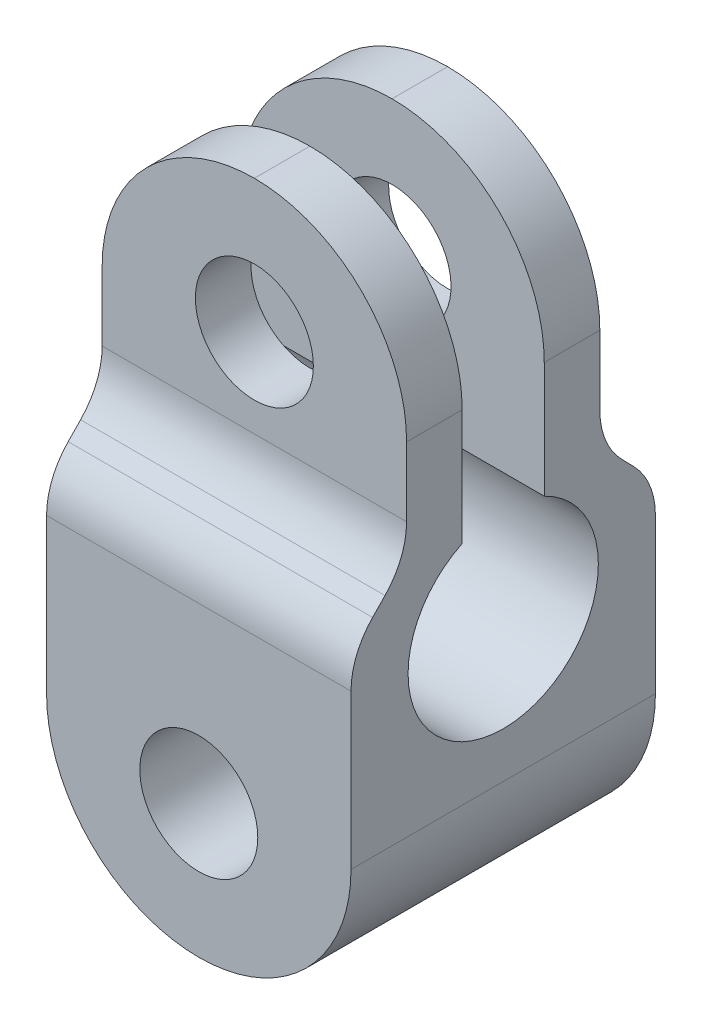
ISO-10303-21;
HEADER;
FILE_DESCRIPTION(('STEP AP214'),'2;1');
FILE_NAME('part.step','',(''),(''),'','','');
FILE_SCHEMA(('AUTOMOTIVE_DESIGN { 1 0 10303 214 1 1 1 1 }'));
ENDSEC;
DATA;
#1=APPLICATION_CONTEXT('core data for automotive mechanical design processes');
#2=APPLICATION_PROTOCOL_DEFINITION('international standard','automotive_design',2000,#1);
#3=PRODUCT_CONTEXT('',#1,'mechanical');
#4=PRODUCT('Part','Part','',(#3));
#5=PRODUCT_RELATED_PRODUCT_CATEGORY('part','',(#4));
#6=PRODUCT_DEFINITION_FORMATION('','',#4);
#7=PRODUCT_DEFINITION_CONTEXT('part definition',#1,'design');
#8=PRODUCT_DEFINITION('design','',#6,#7);
#9=PRODUCT_DEFINITION_SHAPE('','',#8);
#10=(LENGTH_UNIT() NAMED_UNIT(*) SI_UNIT(.MILLI.,.METRE.));
#11=(NAMED_UNIT(*) PLANE_ANGLE_UNIT() SI_UNIT($,.RADIAN.));
#12=(NAMED_UNIT(*) SI_UNIT($,.STERADIAN.) SOLID_ANGLE_UNIT());
#13=UNCERTAINTY_MEASURE_WITH_UNIT(LENGTH_MEASURE(1.E-05),#10,'distance_accuracy_value','');
#14=(GEOMETRIC_REPRESENTATION_CONTEXT(3) GLOBAL_UNCERTAINTY_ASSIGNED_CONTEXT((#13)) GLOBAL_UNIT_ASSIGNED_CONTEXT((#10,
#11,#12)) REPRESENTATION_CONTEXT('',''));
#15=CARTESIAN_POINT('',(0.,0.,0.));
#16=DIRECTION('',(0.,0.,1.));
#17=DIRECTION('',(1.,0.,0.));
#18=AXIS2_PLACEMENT_3D('',#15,#16,#17);
#19=CARTESIAN_POINT('',(-4.,13.,8.));
#20=DIRECTION('',(0.,0.,-1.));
#21=DIRECTION('',(-1.,0.,0.));
#22=AXIS2_PLACEMENT_3D('',#19,#20,#21);
#23=CYLINDRICAL_SURFACE('',#22,4.);
#24=CARTESIAN_POINT('',(-4.,13.,1.46076012645322));
#25=DIRECTION('',(0.,0.,1.));
#26=DIRECTION('',(0.,-1.,0.));
#27=AXIS2_PLACEMENT_3D('',#24,#25,#26);
#28=CIRCLE('',#27,4.);
#29=CARTESIAN_POINT('',(-8.,13.,1.46076012645322));
#30=VERTEX_POINT('',#29);
#31=CARTESIAN_POINT('',(-4.,17.,1.46076012645322));
#32=VERTEX_POINT('',#31);
#33=EDGE_CURVE('E278',#30,#32,#28,.F.);
#34=ORIENTED_EDGE('',*,*,#33,.F.);
#35=DIRECTION('',(0.,0.,-1.));
#36=VECTOR('',#35,1.);
#37=CARTESIAN_POINT('',(-8.,13.,8.));
#38=LINE('',#37,#36);
#39=CARTESIAN_POINT('',(-8.,13.,2.92152025290644));
#40=VERTEX_POINT('',#39);
#41=EDGE_CURVE('E196',#40,#30,#38,.T.);
#42=ORIENTED_EDGE('',*,*,#41,.F.);
#43=CARTESIAN_POINT('',(-4.,13.,2.92152025290644));
#44=DIRECTION('',(0.,0.,-1.));
#45=DIRECTION('',(-1.,0.,0.));
#46=AXIS2_PLACEMENT_3D('',#43,#44,#45);
#47=CIRCLE('',#46,4.);
#48=CARTESIAN_POINT('',(-4.,17.,2.92152025290644));
#49=VERTEX_POINT('',#48);
#50=EDGE_CURVE('E302',#49,#40,#47,.F.);
#51=ORIENTED_EDGE('',*,*,#50,.F.);
#52=DIRECTION('',(0.,0.,-1.));
#53=VECTOR('',#52,1.);
#54=CARTESIAN_POINT('',(-4.,17.,8.));
#55=LINE('',#54,#53);
#56=EDGE_CURVE('E210',#32,#49,#55,.F.);
#57=ORIENTED_EDGE('',*,*,#56,.F.);
#58=EDGE_LOOP('',(#34,#42,#51,#57));
#59=FACE_BOUND('',#58,.T.);
#60=ADVANCED_FACE('F36',(#59),#23,.T.);
#61=CARTESIAN_POINT('',(-4.,13.,8.));
#62=DIRECTION('',(0.,0.,-1.));
#63=DIRECTION('',(-1.,0.,0.));
#64=AXIS2_PLACEMENT_3D('',#61,#62,#63);
#65=CYLINDRICAL_SURFACE('',#64,4.);
#66=CARTESIAN_POINT('',(-4.,13.,1.46076012645322));
#67=DIRECTION('',(0.,0.,1.));
#68=DIRECTION('',(0.,-1.,0.));
#69=AXIS2_PLACEMENT_3D('',#66,#67,#68);
#70=CIRCLE('',#69,4.);
#71=CARTESIAN_POINT('',(0.,13.,1.46076012645322));
#72=VERTEX_POINT('',#71);
#73=EDGE_CURVE('E266',#32,#72,#70,.F.);
#74=ORIENTED_EDGE('',*,*,#73,.F.);
#75=ORIENTED_EDGE('',*,*,#56,.T.);
#76=CARTESIAN_POINT('',(-4.,13.,2.92152025290644));
#77=DIRECTION('',(0.,0.,-1.));
#78=DIRECTION('',(-1.,0.,0.));
#79=AXIS2_PLACEMENT_3D('',#76,#77,#78);
#80=CIRCLE('',#79,4.);
#81=CARTESIAN_POINT('',(0.,13.,2.92152025290644));
#82=VERTEX_POINT('',#81);
#83=EDGE_CURVE('E299',#82,#49,#80,.F.);
#84=ORIENTED_EDGE('',*,*,#83,.F.);
#85=DIRECTION('',(0.,0.,-1.));
#86=VECTOR('',#85,1.);
#87=CARTESIAN_POINT('',(0.,13.,8.));
#88=LINE('',#87,#86);
#89=EDGE_CURVE('E326',#72,#82,#88,.F.);
#90=ORIENTED_EDGE('',*,*,#89,.F.);
#91=EDGE_LOOP('',(#74,#75,#84,#90));
#92=FACE_BOUND('',#91,.T.);
#93=ADVANCED_FACE('F372',(#92),#65,.T.);
#94=CARTESIAN_POINT('',(-4.,13.5,0.));
#95=DIRECTION('',(0.,0.,1.));
#96=DIRECTION('',(1.,0.,0.));
#97=AXIS2_PLACEMENT_3D('',#94,#95,#96);
#98=CYLINDRICAL_SURFACE('',#97,1.55);
#99=CARTESIAN_POINT('',(-4.,13.5,1.46076012645322));
#100=DIRECTION('',(0.,0.,1.));
#101=DIRECTION('',(0.,-1.,0.));
#102=AXIS2_PLACEMENT_3D('',#99,#100,#101);
#103=CIRCLE('',#102,1.55);
#104=CARTESIAN_POINT('',(-4.,11.95,1.46076012645322));
#105=VERTEX_POINT('',#104);
#106=EDGE_CURVE('E179',#105,#105,#103,.F.);
#107=ORIENTED_EDGE('',*,*,#106,.T.);
#108=EDGE_LOOP('',(#107));
#109=FACE_BOUND('',#108,.T.);
#110=CARTESIAN_POINT('',(-4.,13.5,2.92152025290644));
#111=DIRECTION('',(0.,0.,-1.));
#112=DIRECTION('',(-1.,0.,0.));
#113=AXIS2_PLACEMENT_3D('',#110,#111,#112);
#114=CIRCLE('',#113,1.55);
#115=CARTESIAN_POINT('',(-5.55,13.5,2.92152025290644));
#116=VERTEX_POINT('',#115);
#117=EDGE_CURVE('E296',#116,#116,#114,.F.);
#118=ORIENTED_EDGE('',*,*,#117,.T.);
#119=EDGE_LOOP('',(#118));
#120=FACE_BOUND('',#119,.T.);
#121=ADVANCED_FACE('F378',(#109,#120),#98,.F.);
#122=CARTESIAN_POINT('',(0.,17.,8.));
#123=DIRECTION('',(-1.,0.,0.));
#124=DIRECTION('',(0.,0.,1.));
#125=AXIS2_PLACEMENT_3D('',#122,#123,#124);
#126=PLANE('',#125);
#127=DIRECTION('',(0.,-0.71641537047614,0.697674004779837));
#128=VECTOR('',#127,1.);
#129=CARTESIAN_POINT('',(0.,8.86930639376291,8.));
#130=LINE('',#129,#128);
#131=CARTESIAN_POINT('',(0.,9.7869014710346,7.1064091325945));
#132=VERTEX_POINT('',#131);
#133=CARTESIAN_POINT('',(0.,9.45171131649122,7.43283074095228));
#134=VERTEX_POINT('',#133);
#135=EDGE_CURVE('E222',#132,#134,#130,.T.);
#136=ORIENTED_EDGE('',*,*,#135,.T.);
#137=CARTESIAN_POINT('',(0.,8.05636330693154,6.));
#138=DIRECTION('',(-1.,0.,0.));
#139=DIRECTION('',(0.,0.,1.));
#140=AXIS2_PLACEMENT_3D('',#137,#138,#139);
#141=CIRCLE('',#140,2.);
#142=CARTESIAN_POINT('',(0.,8.05636330693154,8.));
#143=VERTEX_POINT('',#142);
#144=EDGE_CURVE('E236',#134,#143,#141,.F.);
#145=ORIENTED_EDGE('',*,*,#144,.T.);
#146=DIRECTION('',(0.,1.,0.));
#147=VECTOR('',#146,1.);
#148=CARTESIAN_POINT('',(0.,17.,8.));
#149=LINE('',#148,#147);
#150=CARTESIAN_POINT('',(0.,4.,8.));
#151=VERTEX_POINT('',#150);
#152=EDGE_CURVE('E316',#151,#143,#149,.T.);
#153=ORIENTED_EDGE('',*,*,#152,.F.);
#154=DIRECTION('',(0.,0.,-1.));
#155=VECTOR('',#154,1.);
#156=CARTESIAN_POINT('',(0.,4.,8.));
#157=LINE('',#156,#155);
#158=CARTESIAN_POINT('',(0.,4.,0.));
#159=VERTEX_POINT('',#158);
#160=EDGE_CURVE('E328',#151,#159,#157,.T.);
#161=ORIENTED_EDGE('',*,*,#160,.T.);
#162=DIRECTION('',(0.,1.,0.));
#163=VECTOR('',#162,1.);
#164=CARTESIAN_POINT('',(0.,17.,0.));
#165=LINE('',#164,#163);
#166=CARTESIAN_POINT('',(0.,8.05636330693154,0.));
#167=VERTEX_POINT('',#166);
#168=EDGE_CURVE('E209',#159,#167,#165,.T.);
#169=ORIENTED_EDGE('',*,*,#168,.T.);
#170=CARTESIAN_POINT('',(0.,8.05636330693154,2.));
#171=DIRECTION('',(-1.,0.,0.));
#172=DIRECTION('',(0.,0.,1.));
#173=AXIS2_PLACEMENT_3D('',#170,#171,#172);
#174=CIRCLE('',#173,2.);
#175=CARTESIAN_POINT('',(0.,9.45171131649122,0.567169259047721));
#176=VERTEX_POINT('',#175);
#177=EDGE_CURVE('E234',#167,#176,#174,.F.);
#178=ORIENTED_EDGE('',*,*,#177,.T.);
#179=DIRECTION('',(0.,0.71641537047614,0.697674004779837));
#180=VECTOR('',#179,1.);
#181=CARTESIAN_POINT('',(0.,8.86930639376291,0.));
#182=LINE('',#181,#180);
#183=CARTESIAN_POINT('',(0.,9.7869014710346,0.893590867405501));
#184=VERTEX_POINT('',#183);
#185=EDGE_CURVE('E268',#176,#184,#182,.T.);
#186=ORIENTED_EDGE('',*,*,#185,.T.);
#187=CARTESIAN_POINT('',(0.,11.1822494805943,-0.539239873546778));
#188=DIRECTION('',(-1.,0.,0.));
#189=DIRECTION('',(0.,0.,1.));
#190=AXIS2_PLACEMENT_3D('',#187,#188,#189);
#191=CIRCLE('',#190,2.);
#192=CARTESIAN_POINT('',(0.,11.1822494805943,1.46076012645322));
#193=VERTEX_POINT('',#192);
#194=EDGE_CURVE('E11',#184,#193,#191,.T.);
#195=ORIENTED_EDGE('',*,*,#194,.T.);
#196=DIRECTION('',(0.,1.,0.));
#197=VECTOR('',#196,1.);
#198=CARTESIAN_POINT('',(0.,10.3693063937629,1.46076012645322));
#199=LINE('',#198,#197);
#200=EDGE_CURVE('E190',#193,#72,#199,.T.);
#201=ORIENTED_EDGE('',*,*,#200,.T.);
#202=ORIENTED_EDGE('',*,*,#89,.T.);
#203=DIRECTION('',(0.,-1.,0.));
#204=VECTOR('',#203,1.);
#205=CARTESIAN_POINT('',(0.,9.95541158884781,2.92152025290644));
#206=LINE('',#205,#204);
#207=CARTESIAN_POINT('',(0.,9.95541158884781,2.92152025290644));
#208=VERTEX_POINT('',#207);
#209=EDGE_CURVE('E284',#82,#208,#206,.T.);
#210=ORIENTED_EDGE('',*,*,#209,.T.);
#211=CARTESIAN_POINT('',(0.,7.7,4.));
#212=DIRECTION('',(-1.,0.,0.));
#213=DIRECTION('',(0.,0.,1.));
#214=AXIS2_PLACEMENT_3D('',#211,#212,#213);
#215=CIRCLE('',#214,2.5);
#216=CARTESIAN_POINT('',(0.,9.95541158884781,5.07847974709356));
#217=VERTEX_POINT('',#216);
#218=EDGE_CURVE('E305',#208,#217,#215,.T.);
#219=ORIENTED_EDGE('',*,*,#218,.T.);
#220=DIRECTION('',(0.,1.,0.));
#221=VECTOR('',#220,1.);
#222=CARTESIAN_POINT('',(0.,9.95541158884781,5.07847974709356));
#223=LINE('',#222,#221);
#224=CARTESIAN_POINT('',(0.,13.,5.07847974709357));
#225=VERTEX_POINT('',#224);
#226=EDGE_CURVE('E281',#217,#225,#223,.T.);
#227=ORIENTED_EDGE('',*,*,#226,.T.);
#228=CARTESIAN_POINT('',(0.,13.,6.53923987354678));
#229=VERTEX_POINT('',#228);
#230=EDGE_CURVE('E322',#225,#229,#88,.F.);
#231=ORIENTED_EDGE('',*,*,#230,.T.);
#232=DIRECTION('',(0.,-1.,0.));
#233=VECTOR('',#232,1.);
#234=CARTESIAN_POINT('',(0.,10.3693063937629,6.53923987354678));
#235=LINE('',#234,#233);
#236=CARTESIAN_POINT('',(0.,11.1822494805943,6.53923987354678));
#237=VERTEX_POINT('',#236);
#238=EDGE_CURVE('E439',#229,#237,#235,.T.);
#239=ORIENTED_EDGE('',*,*,#238,.T.);
#240=CARTESIAN_POINT('',(0.,11.1822494805943,8.53923987354678));
#241=DIRECTION('',(-1.,0.,0.));
#242=DIRECTION('',(0.,0.,1.));
#243=AXIS2_PLACEMENT_3D('',#240,#241,#242);
#244=CIRCLE('',#243,2.);
#245=EDGE_CURVE('E250',#237,#132,#244,.T.);
#246=ORIENTED_EDGE('',*,*,#245,.T.);
#247=EDGE_LOOP('',(#136,#145,#153,#161,#169,#178,#186,#195,#201,#202,#210,#219,#227,#231,#239,#246));
#248=FACE_BOUND('',#247,.T.);
#249=ADVANCED_FACE('F346',(#248),#126,.F.);
#250=CARTESIAN_POINT('',(-8.,0.,8.));
#251=DIRECTION('',(1.,0.,0.));
#252=DIRECTION('',(0.,0.,-1.));
#253=AXIS2_PLACEMENT_3D('',#250,#251,#252);
#254=PLANE('',#253);
#255=DIRECTION('',(0.,-1.,0.));
#256=VECTOR('',#255,1.);
#257=CARTESIAN_POINT('',(-8.,0.,8.));
#258=LINE('',#257,#256);
#259=CARTESIAN_POINT('',(-8.,8.05636330693154,8.));
#260=VERTEX_POINT('',#259);
#261=CARTESIAN_POINT('',(-8.,4.,8.));
#262=VERTEX_POINT('',#261);
#263=EDGE_CURVE('E319',#260,#262,#258,.T.);
#264=ORIENTED_EDGE('',*,*,#263,.F.);
#265=CARTESIAN_POINT('',(-8.,8.05636330693154,6.));
#266=DIRECTION('',(1.,0.,0.));
#267=DIRECTION('',(0.,0.,-1.));
#268=AXIS2_PLACEMENT_3D('',#265,#266,#267);
#269=CIRCLE('',#268,2.);
#270=CARTESIAN_POINT('',(-8.,9.45171131649122,7.43283074095228));
#271=VERTEX_POINT('',#270);
#272=EDGE_CURVE('E227',#260,#271,#269,.F.);
#273=ORIENTED_EDGE('',*,*,#272,.T.);
#274=DIRECTION('',(0.,-0.71641537047614,0.697674004779837));
#275=VECTOR('',#274,1.);
#276=CARTESIAN_POINT('',(-8.,8.86930639376291,8.));
#277=LINE('',#276,#275);
#278=CARTESIAN_POINT('',(-8.,9.7869014710346,7.1064091325945));
#279=VERTEX_POINT('',#278);
#280=EDGE_CURVE('E189',#279,#271,#277,.T.);
#281=ORIENTED_EDGE('',*,*,#280,.F.);
#282=CARTESIAN_POINT('',(-8.,11.1822494805943,8.53923987354678));
#283=DIRECTION('',(1.,0.,0.));
#284=DIRECTION('',(0.,0.,-1.));
#285=AXIS2_PLACEMENT_3D('',#282,#283,#284);
#286=CIRCLE('',#285,2.);
#287=CARTESIAN_POINT('',(-8.,11.1822494805943,6.53923987354678));
#288=VERTEX_POINT('',#287);
#289=EDGE_CURVE('E188',#279,#288,#286,.T.);
#290=ORIENTED_EDGE('',*,*,#289,.T.);
#291=DIRECTION('',(0.,-1.,0.));
#292=VECTOR('',#291,1.);
#293=CARTESIAN_POINT('',(-8.,10.3693063937629,6.53923987354678));
#294=LINE('',#293,#292);
#295=CARTESIAN_POINT('',(-8.,13.,6.53923987354678));
#296=VERTEX_POINT('',#295);
#297=EDGE_CURVE('E171',#296,#288,#294,.T.);
#298=ORIENTED_EDGE('',*,*,#297,.F.);
#299=CARTESIAN_POINT('',(-8.,13.,5.07847974709356));
#300=VERTEX_POINT('',#299);
#301=EDGE_CURVE('E185',#296,#300,#38,.T.);
#302=ORIENTED_EDGE('',*,*,#301,.T.);
#303=DIRECTION('',(0.,1.,0.));
#304=VECTOR('',#303,1.);
#305=CARTESIAN_POINT('',(-8.,9.95541158884781,5.07847974709356));
#306=LINE('',#305,#304);
#307=CARTESIAN_POINT('',(-8.,9.95541158884781,5.07847974709356));
#308=VERTEX_POINT('',#307);
#309=EDGE_CURVE('E280',#308,#300,#306,.T.);
#310=ORIENTED_EDGE('',*,*,#309,.F.);
#311=CARTESIAN_POINT('',(-8.,7.7,4.));
#312=DIRECTION('',(-1.,0.,0.));
#313=DIRECTION('',(0.,0.,1.));
#314=AXIS2_PLACEMENT_3D('',#311,#312,#313);
#315=CIRCLE('',#314,2.5);
#316=CARTESIAN_POINT('',(-8.,9.95541158884781,2.92152025290644));
#317=VERTEX_POINT('',#316);
#318=EDGE_CURVE('E304',#317,#308,#315,.T.);
#319=ORIENTED_EDGE('',*,*,#318,.F.);
#320=DIRECTION('',(0.,-1.,0.));
#321=VECTOR('',#320,1.);
#322=CARTESIAN_POINT('',(-8.,9.95541158884781,2.92152025290644));
#323=LINE('',#322,#321);
#324=EDGE_CURVE('E285',#40,#317,#323,.T.);
#325=ORIENTED_EDGE('',*,*,#324,.F.);
#326=ORIENTED_EDGE('',*,*,#41,.T.);
#327=DIRECTION('',(0.,1.,0.));
#328=VECTOR('',#327,1.);
#329=CARTESIAN_POINT('',(-8.,10.3693063937629,1.46076012645322));
#330=LINE('',#329,#328);
#331=CARTESIAN_POINT('',(-8.,11.1822494805943,1.46076012645322));
#332=VERTEX_POINT('',#331);
#333=EDGE_CURVE('E254',#332,#30,#330,.T.);
#334=ORIENTED_EDGE('',*,*,#333,.F.);
#335=CARTESIAN_POINT('',(-8.,11.1822494805943,-0.539239873546778));
#336=DIRECTION('',(1.,0.,0.));
#337=DIRECTION('',(0.,0.,-1.));
#338=AXIS2_PLACEMENT_3D('',#335,#336,#337);
#339=CIRCLE('',#338,2.);
#340=CARTESIAN_POINT('',(-8.,9.7869014710346,0.893590867405501));
#341=VERTEX_POINT('',#340);
#342=EDGE_CURVE('E44',#332,#341,#339,.T.);
#343=ORIENTED_EDGE('',*,*,#342,.T.);
#344=DIRECTION('',(0.,0.71641537047614,0.697674004779837));
#345=VECTOR('',#344,1.);
#346=CARTESIAN_POINT('',(-8.,8.86930639376291,0.));
#347=LINE('',#346,#345);
#348=CARTESIAN_POINT('',(-8.,9.45171131649122,0.567169259047721));
#349=VERTEX_POINT('',#348);
#350=EDGE_CURVE('E253',#349,#341,#347,.T.);
#351=ORIENTED_EDGE('',*,*,#350,.F.);
#352=CARTESIAN_POINT('',(-8.,8.05636330693154,2.));
#353=DIRECTION('',(1.,0.,0.));
#354=DIRECTION('',(0.,0.,-1.));
#355=AXIS2_PLACEMENT_3D('',#352,#353,#354);
#356=CIRCLE('',#355,2.);
#357=CARTESIAN_POINT('',(-8.,8.05636330693154,0.));
#358=VERTEX_POINT('',#357);
#359=EDGE_CURVE('E225',#349,#358,#356,.F.);
#360=ORIENTED_EDGE('',*,*,#359,.T.);
#361=DIRECTION('',(0.,-1.,0.));
#362=VECTOR('',#361,1.);
#363=CARTESIAN_POINT('',(-8.,0.,0.));
#364=LINE('',#363,#362);
#365=CARTESIAN_POINT('',(-8.,4.,0.));
#366=VERTEX_POINT('',#365);
#367=EDGE_CURVE('E320',#358,#366,#364,.T.);
#368=ORIENTED_EDGE('',*,*,#367,.T.);
#369=DIRECTION('',(0.,0.,-1.));
#370=VECTOR('',#369,1.);
#371=CARTESIAN_POINT('',(-8.,4.,8.));
#372=LINE('',#371,#370);
#373=EDGE_CURVE('E195',#366,#262,#372,.F.);
#374=ORIENTED_EDGE('',*,*,#373,.T.);
#375=EDGE_LOOP('',(#264,#273,#281,#290,#298,#302,#310,#319,#325,#326,#334,#343,#351,#360,#368,#374));
#376=FACE_BOUND('',#375,.T.);
#377=ADVANCED_FACE('F183',(#376),#254,.F.);
#378=CARTESIAN_POINT('',(0.,0.,8.));
#379=DIRECTION('',(0.,0.,-1.));
#380=DIRECTION('',(-1.,0.,0.));
#381=AXIS2_PLACEMENT_3D('',#378,#379,#380);
#382=PLANE('',#381);
#383=CARTESIAN_POINT('',(-4.,3.5,8.));
#384=DIRECTION('',(0.,0.,1.));
#385=DIRECTION('',(1.,0.,0.));
#386=AXIS2_PLACEMENT_3D('',#383,#384,#385);
#387=CIRCLE('',#386,1.55);
#388=CARTESIAN_POINT('',(-2.45,3.5,8.));
#389=VERTEX_POINT('',#388);
#390=EDGE_CURVE('E308',#389,#389,#387,.T.);
#391=ORIENTED_EDGE('',*,*,#390,.F.);
#392=EDGE_LOOP('',(#391));
#393=FACE_BOUND('',#392,.T.);
#394=ORIENTED_EDGE('',*,*,#152,.T.);
#395=DIRECTION('',(-1.,0.,0.));
#396=VECTOR('',#395,1.);
#397=CARTESIAN_POINT('',(0.,8.05636330693154,8.));
#398=LINE('',#397,#396);
#399=EDGE_CURVE('E218',#143,#260,#398,.T.);
#400=ORIENTED_EDGE('',*,*,#399,.T.);
#401=ORIENTED_EDGE('',*,*,#263,.T.);
#402=CARTESIAN_POINT('',(-4.,4.,8.));
#403=DIRECTION('',(0.,0.,-1.));
#404=DIRECTION('',(-1.,0.,0.));
#405=AXIS2_PLACEMENT_3D('',#402,#403,#404);
#406=CIRCLE('',#405,4.);
#407=CARTESIAN_POINT('',(-4.,0.,8.));
#408=VERTEX_POINT('',#407);
#409=EDGE_CURVE('E335',#262,#408,#406,.F.);
#410=ORIENTED_EDGE('',*,*,#409,.T.);
#411=CARTESIAN_POINT('',(-4.,4.,8.));
#412=DIRECTION('',(0.,0.,-1.));
#413=DIRECTION('',(-1.,0.,0.));
#414=AXIS2_PLACEMENT_3D('',#411,#412,#413);
#415=CIRCLE('',#414,4.);
#416=EDGE_CURVE('E202',#408,#151,#415,.F.);
#417=ORIENTED_EDGE('',*,*,#416,.T.);
#418=EDGE_LOOP('',(#394,#400,#401,#410,#417));
#419=FACE_BOUND('',#418,.T.);
#420=ADVANCED_FACE('F341',(#393,#419),#382,.F.);
#421=CARTESIAN_POINT('',(0.,0.,0.));
#422=DIRECTION('',(0.,0.,-1.));
#423=DIRECTION('',(-1.,0.,0.));
#424=AXIS2_PLACEMENT_3D('',#421,#422,#423);
#425=PLANE('',#424);
#426=ORIENTED_EDGE('',*,*,#367,.F.);
#427=DIRECTION('',(-1.,0.,0.));
#428=VECTOR('',#427,1.);
#429=CARTESIAN_POINT('',(0.,8.05636330693154,0.));
#430=LINE('',#429,#428);
#431=EDGE_CURVE('E244',#358,#167,#430,.F.);
#432=ORIENTED_EDGE('',*,*,#431,.T.);
#433=ORIENTED_EDGE('',*,*,#168,.F.);
#434=CARTESIAN_POINT('',(-4.,4.,0.));
#435=DIRECTION('',(0.,0.,-1.));
#436=DIRECTION('',(-1.,0.,0.));
#437=AXIS2_PLACEMENT_3D('',#434,#435,#436);
#438=CIRCLE('',#437,4.);
#439=CARTESIAN_POINT('',(-4.,0.,0.));
#440=VERTEX_POINT('',#439);
#441=EDGE_CURVE('E334',#159,#440,#438,.T.);
#442=ORIENTED_EDGE('',*,*,#441,.T.);
#443=CARTESIAN_POINT('',(-4.,4.,0.));
#444=DIRECTION('',(0.,0.,-1.));
#445=DIRECTION('',(-1.,0.,0.));
#446=AXIS2_PLACEMENT_3D('',#443,#444,#445);
#447=CIRCLE('',#446,4.);
#448=EDGE_CURVE('E331',#440,#366,#447,.T.);
#449=ORIENTED_EDGE('',*,*,#448,.T.);
#450=EDGE_LOOP('',(#426,#432,#433,#442,#449));
#451=FACE_BOUND('',#450,.T.);
#452=CARTESIAN_POINT('',(-4.,3.5,0.));
#453=DIRECTION('',(0.,0.,1.));
#454=DIRECTION('',(1.,0.,0.));
#455=AXIS2_PLACEMENT_3D('',#452,#453,#454);
#456=CIRCLE('',#455,1.55);
#457=CARTESIAN_POINT('',(-2.45,3.5,0.));
#458=VERTEX_POINT('',#457);
#459=EDGE_CURVE('E311',#458,#458,#456,.T.);
#460=ORIENTED_EDGE('',*,*,#459,.T.);
#461=EDGE_LOOP('',(#460));
#462=FACE_BOUND('',#461,.T.);
#463=ADVANCED_FACE('F353',(#451,#462),#425,.T.);
#464=CARTESIAN_POINT('',(-4.,4.,8.));
#465=DIRECTION('',(0.,0.,-1.));
#466=DIRECTION('',(-1.,0.,0.));
#467=AXIS2_PLACEMENT_3D('',#464,#465,#466);
#468=CYLINDRICAL_SURFACE('',#467,4.);
#469=DIRECTION('',(0.,0.,-1.));
#470=VECTOR('',#469,1.);
#471=CARTESIAN_POINT('',(-4.,0.,8.));
#472=LINE('',#471,#470);
#473=EDGE_CURVE('E206',#408,#440,#472,.T.);
#474=ORIENTED_EDGE('',*,*,#473,.F.);
#475=ORIENTED_EDGE('',*,*,#409,.F.);
#476=ORIENTED_EDGE('',*,*,#373,.F.);
#477=ORIENTED_EDGE('',*,*,#448,.F.);
#478=EDGE_LOOP('',(#474,#475,#476,#477));
#479=FACE_BOUND('',#478,.T.);
#480=ADVANCED_FACE('F357',(#479),#468,.T.);
#481=CARTESIAN_POINT('',(-4.,4.,8.));
#482=DIRECTION('',(0.,0.,-1.));
#483=DIRECTION('',(-1.,0.,0.));
#484=AXIS2_PLACEMENT_3D('',#481,#482,#483);
#485=CYLINDRICAL_SURFACE('',#484,4.);
#486=ORIENTED_EDGE('',*,*,#416,.F.);
#487=ORIENTED_EDGE('',*,*,#473,.T.);
#488=ORIENTED_EDGE('',*,*,#441,.F.);
#489=ORIENTED_EDGE('',*,*,#160,.F.);
#490=EDGE_LOOP('',(#486,#487,#488,#489));
#491=FACE_BOUND('',#490,.T.);
#492=ADVANCED_FACE('F349',(#491),#485,.T.);
#493=CARTESIAN_POINT('',(-4.,13.,6.53923987354678));
#494=DIRECTION('',(0.,0.,-1.));
#495=DIRECTION('',(-1.,0.,0.));
#496=AXIS2_PLACEMENT_3D('',#493,#494,#495);
#497=CIRCLE('',#496,4.);
#498=CARTESIAN_POINT('',(-4.,17.,6.53923987354678));
#499=VERTEX_POINT('',#498);
#500=EDGE_CURVE('E167',#499,#296,#497,.F.);
#501=ORIENTED_EDGE('',*,*,#500,.F.);
#502=CARTESIAN_POINT('',(-4.,17.,5.07847974709356));
#503=VERTEX_POINT('',#502);
#504=EDGE_CURVE('E212',#503,#499,#55,.F.);
#505=ORIENTED_EDGE('',*,*,#504,.F.);
#506=CARTESIAN_POINT('',(-4.,13.,5.07847974709356));
#507=DIRECTION('',(0.,0.,1.));
#508=DIRECTION('',(1.,0.,0.));
#509=AXIS2_PLACEMENT_3D('',#506,#507,#508);
#510=CIRCLE('',#509,4.);
#511=EDGE_CURVE('E194',#300,#503,#510,.F.);
#512=ORIENTED_EDGE('',*,*,#511,.F.);
#513=ORIENTED_EDGE('',*,*,#301,.F.);
#514=EDGE_LOOP('',(#501,#505,#512,#513));
#515=FACE_BOUND('',#514,.T.);
#516=ADVANCED_FACE('F193',(#515),#23,.T.);
#517=CARTESIAN_POINT('',(-4.,13.,6.53923987354678));
#518=DIRECTION('',(0.,0.,-1.));
#519=DIRECTION('',(-1.,0.,0.));
#520=AXIS2_PLACEMENT_3D('',#517,#518,#519);
#521=CIRCLE('',#520,4.);
#522=EDGE_CURVE('E174',#229,#499,#521,.F.);
#523=ORIENTED_EDGE('',*,*,#522,.F.);
#524=ORIENTED_EDGE('',*,*,#230,.F.);
#525=CARTESIAN_POINT('',(-4.,13.,5.07847974709356));
#526=DIRECTION('',(0.,0.,1.));
#527=DIRECTION('',(1.,0.,0.));
#528=AXIS2_PLACEMENT_3D('',#525,#526,#527);
#529=CIRCLE('',#528,4.);
#530=EDGE_CURVE('E293',#503,#225,#529,.F.);
#531=ORIENTED_EDGE('',*,*,#530,.F.);
#532=ORIENTED_EDGE('',*,*,#504,.T.);
#533=EDGE_LOOP('',(#523,#524,#531,#532));
#534=FACE_BOUND('',#533,.T.);
#535=ADVANCED_FACE('F381',(#534),#65,.T.);
#536=CARTESIAN_POINT('',(-4.,3.5,0.));
#537=DIRECTION('',(0.,0.,1.));
#538=DIRECTION('',(1.,0.,0.));
#539=AXIS2_PLACEMENT_3D('',#536,#537,#538);
#540=CYLINDRICAL_SURFACE('',#539,1.55);
#541=ORIENTED_EDGE('',*,*,#459,.F.);
#542=EDGE_LOOP('',(#541));
#543=FACE_BOUND('',#542,.T.);
#544=ORIENTED_EDGE('',*,*,#390,.T.);
#545=EDGE_LOOP('',(#544));
#546=FACE_BOUND('',#545,.T.);
#547=ADVANCED_FACE('F388',(#543,#546),#540,.F.);
#548=CARTESIAN_POINT('',(-4.,13.5,6.53923987354678));
#549=DIRECTION('',(0.,0.,-1.));
#550=DIRECTION('',(-1.,0.,0.));
#551=AXIS2_PLACEMENT_3D('',#548,#549,#550);
#552=CIRCLE('',#551,1.55);
#553=CARTESIAN_POINT('',(-5.55,13.5,6.53923987354678));
#554=VERTEX_POINT('',#553);
#555=EDGE_CURVE('E219',#554,#554,#552,.F.);
#556=ORIENTED_EDGE('',*,*,#555,.T.);
#557=EDGE_LOOP('',(#556));
#558=FACE_BOUND('',#557,.T.);
#559=CARTESIAN_POINT('',(-4.,13.5,5.07847974709356));
#560=DIRECTION('',(0.,0.,1.));
#561=DIRECTION('',(1.,0.,0.));
#562=AXIS2_PLACEMENT_3D('',#559,#560,#561);
#563=CIRCLE('',#562,1.55);
#564=CARTESIAN_POINT('',(-2.45,13.5,5.07847974709356));
#565=VERTEX_POINT('',#564);
#566=EDGE_CURVE('E288',#565,#565,#563,.F.);
#567=ORIENTED_EDGE('',*,*,#566,.T.);
#568=EDGE_LOOP('',(#567));
#569=FACE_BOUND('',#568,.T.);
#570=ADVANCED_FACE('F407',(#558,#569),#98,.F.);
#571=CARTESIAN_POINT('',(0.,7.7,4.));
#572=DIRECTION('',(-1.,0.,0.));
#573=DIRECTION('',(0.,0.,1.));
#574=AXIS2_PLACEMENT_3D('',#571,#572,#573);
#575=CYLINDRICAL_SURFACE('',#574,2.5);
#576=ORIENTED_EDGE('',*,*,#218,.F.);
#577=DIRECTION('',(-1.,0.,0.));
#578=VECTOR('',#577,1.);
#579=CARTESIAN_POINT('',(0.,9.95541158884781,2.92152025290644));
#580=LINE('',#579,#578);
#581=EDGE_CURVE('E215',#208,#317,#580,.T.);
#582=ORIENTED_EDGE('',*,*,#581,.T.);
#583=ORIENTED_EDGE('',*,*,#318,.T.);
#584=DIRECTION('',(-1.,0.,0.));
#585=VECTOR('',#584,1.);
#586=CARTESIAN_POINT('',(0.,9.95541158884781,5.07847974709356));
#587=LINE('',#586,#585);
#588=EDGE_CURVE('E199',#308,#217,#587,.F.);
#589=ORIENTED_EDGE('',*,*,#588,.T.);
#590=EDGE_LOOP('',(#576,#582,#583,#589));
#591=FACE_BOUND('',#590,.T.);
#592=ADVANCED_FACE('F411',(#591),#575,.F.);
#593=CARTESIAN_POINT('',(0.,9.95541158884781,5.07847974709356));
#594=DIRECTION('',(0.,0.,1.));
#595=DIRECTION('',(1.,0.,0.));
#596=AXIS2_PLACEMENT_3D('',#593,#594,#595);
#597=PLANE('',#596);
#598=ORIENTED_EDGE('',*,*,#511,.T.);
#599=ORIENTED_EDGE('',*,*,#530,.T.);
#600=ORIENTED_EDGE('',*,*,#226,.F.);
#601=ORIENTED_EDGE('',*,*,#588,.F.);
#602=ORIENTED_EDGE('',*,*,#309,.T.);
#603=EDGE_LOOP('',(#598,#599,#600,#601,#602));
#604=FACE_BOUND('',#603,.T.);
#605=ORIENTED_EDGE('',*,*,#566,.F.);
#606=EDGE_LOOP('',(#605));
#607=FACE_BOUND('',#606,.T.);
#608=ADVANCED_FACE('F415',(#604,#607),#597,.F.);
#609=CARTESIAN_POINT('',(0.,9.95541158884781,2.92152025290644));
#610=DIRECTION('',(0.,0.,-1.));
#611=DIRECTION('',(-1.,0.,0.));
#612=AXIS2_PLACEMENT_3D('',#609,#610,#611);
#613=PLANE('',#612);
#614=ORIENTED_EDGE('',*,*,#50,.T.);
#615=ORIENTED_EDGE('',*,*,#324,.T.);
#616=ORIENTED_EDGE('',*,*,#581,.F.);
#617=ORIENTED_EDGE('',*,*,#209,.F.);
#618=ORIENTED_EDGE('',*,*,#83,.T.);
#619=EDGE_LOOP('',(#614,#615,#616,#617,#618));
#620=FACE_BOUND('',#619,.T.);
#621=ORIENTED_EDGE('',*,*,#117,.F.);
#622=EDGE_LOOP('',(#621));
#623=FACE_BOUND('',#622,.T.);
#624=ADVANCED_FACE('F419',(#620,#623),#613,.F.);
#625=CARTESIAN_POINT('',(0.,10.3693063937629,6.53923987354678));
#626=DIRECTION('',(0.,0.,-1.));
#627=DIRECTION('',(-1.,0.,0.));
#628=AXIS2_PLACEMENT_3D('',#625,#626,#627);
#629=PLANE('',#628);
#630=ORIENTED_EDGE('',*,*,#297,.T.);
#631=DIRECTION('',(-1.,0.,0.));
#632=VECTOR('',#631,1.);
#633=CARTESIAN_POINT('',(0.,11.1822494805943,6.53923987354678));
#634=LINE('',#633,#632);
#635=EDGE_CURVE('E238',#288,#237,#634,.F.);
#636=ORIENTED_EDGE('',*,*,#635,.T.);
#637=ORIENTED_EDGE('',*,*,#238,.F.);
#638=ORIENTED_EDGE('',*,*,#522,.T.);
#639=ORIENTED_EDGE('',*,*,#500,.T.);
#640=EDGE_LOOP('',(#630,#636,#637,#638,#639));
#641=FACE_BOUND('',#640,.T.);
#642=ORIENTED_EDGE('',*,*,#555,.F.);
#643=EDGE_LOOP('',(#642));
#644=FACE_BOUND('',#643,.T.);
#645=ADVANCED_FACE('F169',(#641,#644),#629,.F.);
#646=CARTESIAN_POINT('',(0.,8.86930639376291,8.));
#647=DIRECTION('',(0.,-0.697674004779837,-0.71641537047614));
#648=DIRECTION('',(0.,0.71641537047614,-0.697674004779837));
#649=AXIS2_PLACEMENT_3D('',#646,#647,#648);
#650=PLANE('',#649);
#651=ORIENTED_EDGE('',*,*,#280,.T.);
#652=DIRECTION('',(-1.,0.,0.));
#653=VECTOR('',#652,1.);
#654=CARTESIAN_POINT('',(0.,9.45171131649122,7.43283074095228));
#655=LINE('',#654,#653);
#656=EDGE_CURVE('E232',#271,#134,#655,.F.);
#657=ORIENTED_EDGE('',*,*,#656,.T.);
#658=ORIENTED_EDGE('',*,*,#135,.F.);
#659=DIRECTION('',(-1.,0.,0.));
#660=VECTOR('',#659,1.);
#661=CARTESIAN_POINT('',(-8.,9.7869014710346,7.1064091325945));
#662=LINE('',#661,#660);
#663=EDGE_CURVE('E229',#132,#279,#662,.T.);
#664=ORIENTED_EDGE('',*,*,#663,.T.);
#665=EDGE_LOOP('',(#651,#657,#658,#664));
#666=FACE_BOUND('',#665,.T.);
#667=ADVANCED_FACE('F428',(#666),#650,.F.);
#668=CARTESIAN_POINT('',(0.,10.3693063937629,1.46076012645322));
#669=DIRECTION('',(0.,0.,1.));
#670=DIRECTION('',(0.,-1.,0.));
#671=AXIS2_PLACEMENT_3D('',#668,#669,#670);
#672=PLANE('',#671);
#673=ORIENTED_EDGE('',*,*,#200,.F.);
#674=DIRECTION('',(-1.,0.,0.));
#675=VECTOR('',#674,1.);
#676=CARTESIAN_POINT('',(-8.,11.1822494805943,1.46076012645322));
#677=LINE('',#676,#675);
#678=EDGE_CURVE('E246',#193,#332,#677,.T.);
#679=ORIENTED_EDGE('',*,*,#678,.T.);
#680=ORIENTED_EDGE('',*,*,#333,.T.);
#681=ORIENTED_EDGE('',*,*,#33,.T.);
#682=ORIENTED_EDGE('',*,*,#73,.T.);
#683=EDGE_LOOP('',(#673,#679,#680,#681,#682));
#684=FACE_BOUND('',#683,.T.);
#685=ORIENTED_EDGE('',*,*,#106,.F.);
#686=EDGE_LOOP('',(#685));
#687=FACE_BOUND('',#686,.T.);
#688=ADVANCED_FACE('F261',(#684,#687),#672,.F.);
#689=CARTESIAN_POINT('',(0.,8.86930639376291,0.));
#690=DIRECTION('',(0.,-0.697674004779837,0.71641537047614));
#691=DIRECTION('',(0.,-0.71641537047614,-0.697674004779837));
#692=AXIS2_PLACEMENT_3D('',#689,#690,#691);
#693=PLANE('',#692);
#694=ORIENTED_EDGE('',*,*,#185,.F.);
#695=DIRECTION('',(-1.,0.,0.));
#696=VECTOR('',#695,1.);
#697=CARTESIAN_POINT('',(-8.,9.45171131649122,0.567169259047721));
#698=LINE('',#697,#696);
#699=EDGE_CURVE('E241',#176,#349,#698,.T.);
#700=ORIENTED_EDGE('',*,*,#699,.T.);
#701=ORIENTED_EDGE('',*,*,#350,.T.);
#702=DIRECTION('',(-1.,0.,0.));
#703=VECTOR('',#702,1.);
#704=CARTESIAN_POINT('',(0.,9.7869014710346,0.893590867405501));
#705=LINE('',#704,#703);
#706=EDGE_CURVE('E57',#341,#184,#705,.F.);
#707=ORIENTED_EDGE('',*,*,#706,.T.);
#708=EDGE_LOOP('',(#694,#700,#701,#707));
#709=FACE_BOUND('',#708,.T.);
#710=ADVANCED_FACE('F257',(#709),#693,.F.);
#711=CARTESIAN_POINT('',(0.,8.05636330693154,6.));
#712=DIRECTION('',(-1.,0.,0.));
#713=DIRECTION('',(0.,0.,1.));
#714=AXIS2_PLACEMENT_3D('',#711,#712,#713);
#715=CYLINDRICAL_SURFACE('',#714,2.);
#716=ORIENTED_EDGE('',*,*,#144,.F.);
#717=ORIENTED_EDGE('',*,*,#656,.F.);
#718=ORIENTED_EDGE('',*,*,#272,.F.);
#719=ORIENTED_EDGE('',*,*,#399,.F.);
#720=EDGE_LOOP('',(#716,#717,#718,#719));
#721=FACE_BOUND('',#720,.T.);
#722=ADVANCED_FACE('F368',(#721),#715,.T.);
#723=CARTESIAN_POINT('',(0.,11.1822494805943,8.53923987354678));
#724=DIRECTION('',(1.,0.,0.));
#725=DIRECTION('',(0.,0.,-1.));
#726=AXIS2_PLACEMENT_3D('',#723,#724,#725);
#727=CYLINDRICAL_SURFACE('',#726,2.);
#728=ORIENTED_EDGE('',*,*,#245,.F.);
#729=ORIENTED_EDGE('',*,*,#635,.F.);
#730=ORIENTED_EDGE('',*,*,#289,.F.);
#731=ORIENTED_EDGE('',*,*,#663,.F.);
#732=EDGE_LOOP('',(#728,#729,#730,#731));
#733=FACE_BOUND('',#732,.T.);
#734=ADVANCED_FACE('F363',(#733),#727,.F.);
#735=CARTESIAN_POINT('',(0.,8.05636330693154,2.));
#736=DIRECTION('',(1.,0.,0.));
#737=DIRECTION('',(0.,0.,-1.));
#738=AXIS2_PLACEMENT_3D('',#735,#736,#737);
#739=CYLINDRICAL_SURFACE('',#738,2.);
#740=ORIENTED_EDGE('',*,*,#177,.F.);
#741=ORIENTED_EDGE('',*,*,#431,.F.);
#742=ORIENTED_EDGE('',*,*,#359,.F.);
#743=ORIENTED_EDGE('',*,*,#699,.F.);
#744=EDGE_LOOP('',(#740,#741,#742,#743));
#745=FACE_BOUND('',#744,.T.);
#746=ADVANCED_FACE('F361',(#745),#739,.T.);
#747=CARTESIAN_POINT('',(0.,11.1822494805943,-0.539239873546778));
#748=DIRECTION('',(1.,0.,0.));
#749=DIRECTION('',(0.,0.,-1.));
#750=AXIS2_PLACEMENT_3D('',#747,#748,#749);
#751=CYLINDRICAL_SURFACE('',#750,2.);
#752=ORIENTED_EDGE('',*,*,#194,.F.);
#753=ORIENTED_EDGE('',*,*,#706,.F.);
#754=ORIENTED_EDGE('',*,*,#342,.F.);
#755=ORIENTED_EDGE('',*,*,#678,.F.);
#756=EDGE_LOOP('',(#752,#753,#754,#755));
#757=FACE_BOUND('',#756,.T.);
#758=ADVANCED_FACE('F38',(#757),#751,.F.);
#759=CLOSED_SHELL('',(#60,#93,#121,#249,#377,#420,#463,#480,#492,#516,#535,#547,#570,#592,#608,
#624,#645,#667,#688,#710,#722,#734,#746,#758));
#760=MANIFOLD_SOLID_BREP('B2',#759);
#761=ADVANCED_BREP_SHAPE_REPRESENTATION('',(#18,#760),#14);
#762=SHAPE_DEFINITION_REPRESENTATION(#9,#761);
ENDSEC;
END-ISO-10303-21;
